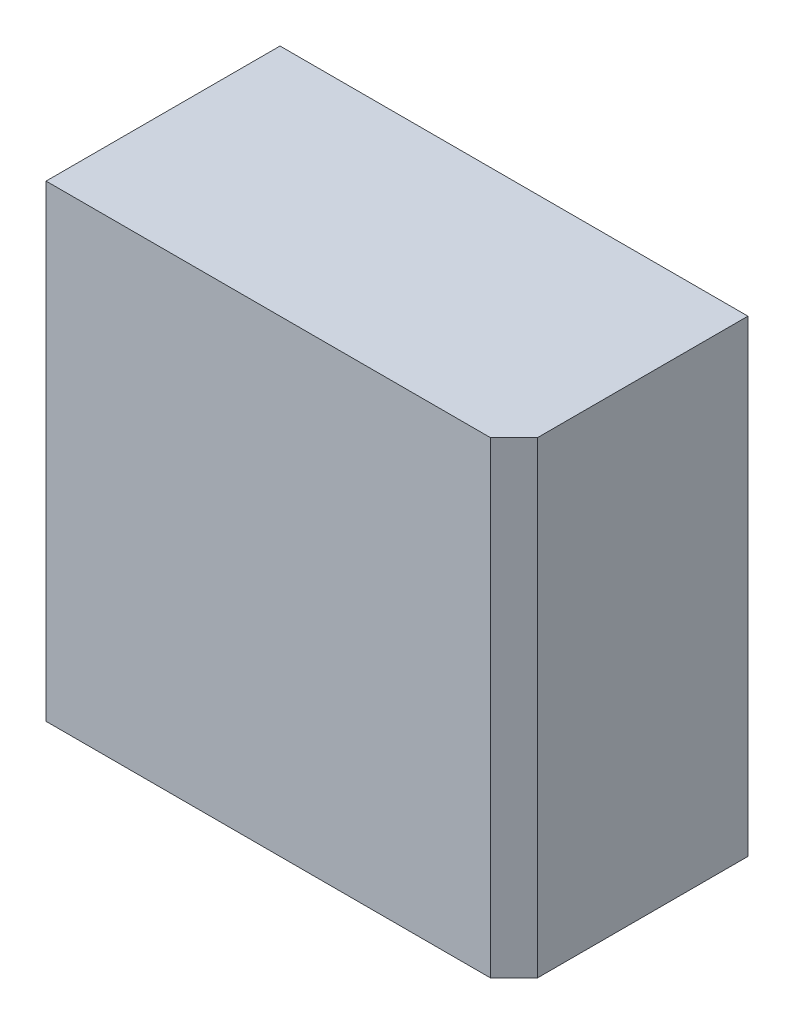
ISO-10303-21;
HEADER;
FILE_DESCRIPTION(('STEP AP214'),'2;1');
FILE_NAME('part.step','',(''),(''),'','','');
FILE_SCHEMA(('AUTOMOTIVE_DESIGN { 1 0 10303 214 1 1 1 1 }'));
ENDSEC;
DATA;
#1=APPLICATION_CONTEXT('core data for automotive mechanical design processes');
#2=APPLICATION_PROTOCOL_DEFINITION('international standard','automotive_design',2000,#1);
#3=PRODUCT_CONTEXT('',#1,'mechanical');
#4=PRODUCT('Part','Part','',(#3));
#5=PRODUCT_RELATED_PRODUCT_CATEGORY('part','',(#4));
#6=PRODUCT_DEFINITION_FORMATION('','',#4);
#7=PRODUCT_DEFINITION_CONTEXT('part definition',#1,'design');
#8=PRODUCT_DEFINITION('design','',#6,#7);
#9=PRODUCT_DEFINITION_SHAPE('','',#8);
#10=(LENGTH_UNIT() NAMED_UNIT(*) SI_UNIT(.MILLI.,.METRE.));
#11=(NAMED_UNIT(*) PLANE_ANGLE_UNIT() SI_UNIT($,.RADIAN.));
#12=(NAMED_UNIT(*) SI_UNIT($,.STERADIAN.) SOLID_ANGLE_UNIT());
#13=UNCERTAINTY_MEASURE_WITH_UNIT(LENGTH_MEASURE(1.E-05),#10,'distance_accuracy_value','');
#14=(GEOMETRIC_REPRESENTATION_CONTEXT(3) GLOBAL_UNCERTAINTY_ASSIGNED_CONTEXT((#13)) GLOBAL_UNIT_ASSIGNED_CONTEXT((#10,
#11,#12)) REPRESENTATION_CONTEXT('',''));
#15=CARTESIAN_POINT('',(0.,0.,0.));
#16=DIRECTION('',(0.,0.,1.));
#17=DIRECTION('',(1.,0.,0.));
#18=AXIS2_PLACEMENT_3D('',#15,#16,#17);
#19=CARTESIAN_POINT('',(-50.,-50.,50.));
#20=DIRECTION('',(1.,0.,0.));
#21=DIRECTION('',(0.,0.,-1.));
#22=AXIS2_PLACEMENT_3D('',#19,#20,#21);
#23=PLANE('',#22);
#24=DIRECTION('',(0.,-1.,0.));
#25=VECTOR('',#24,1.);
#26=CARTESIAN_POINT('',(-50.,-50.,0.));
#27=LINE('',#26,#25);
#28=CARTESIAN_POINT('',(-50.,50.,0.));
#29=VERTEX_POINT('',#28);
#30=CARTESIAN_POINT('',(-50.,-50.,0.));
#31=VERTEX_POINT('',#30);
#32=EDGE_CURVE('E112',#29,#31,#27,.T.);
#33=ORIENTED_EDGE('',*,*,#32,.T.);
#34=DIRECTION('',(0.,0.,-1.));
#35=VECTOR('',#34,1.);
#36=CARTESIAN_POINT('',(-50.,-50.,50.));
#37=LINE('',#36,#35);
#38=CARTESIAN_POINT('',(-50.,-50.,50.));
#39=VERTEX_POINT('',#38);
#40=EDGE_CURVE('E93',#39,#31,#37,.T.);
#41=ORIENTED_EDGE('',*,*,#40,.F.);
#42=DIRECTION('',(0.,-1.,0.));
#43=VECTOR('',#42,1.);
#44=CARTESIAN_POINT('',(-50.,-50.,50.));
#45=LINE('',#44,#43);
#46=CARTESIAN_POINT('',(-50.,50.,50.));
#47=VERTEX_POINT('',#46);
#48=EDGE_CURVE('E101',#47,#39,#45,.T.);
#49=ORIENTED_EDGE('',*,*,#48,.F.);
#50=DIRECTION('',(0.,0.,-1.));
#51=VECTOR('',#50,1.);
#52=CARTESIAN_POINT('',(-50.,50.,50.));
#53=LINE('',#52,#51);
#54=EDGE_CURVE('E128',#47,#29,#53,.T.);
#55=ORIENTED_EDGE('',*,*,#54,.T.);
#56=EDGE_LOOP('',(#33,#41,#49,#55));
#57=FACE_BOUND('',#56,.T.);
#58=ADVANCED_FACE('F41',(#57),#23,.F.);
#59=CARTESIAN_POINT('',(50.,-50.,50.));
#60=DIRECTION('',(0.,1.,0.));
#61=DIRECTION('',(-1.,0.,0.));
#62=AXIS2_PLACEMENT_3D('',#59,#60,#61);
#63=PLANE('',#62);
#64=DIRECTION('',(0.,0.,-1.));
#65=VECTOR('',#64,1.);
#66=CARTESIAN_POINT('',(50.,-50.,50.));
#67=LINE('',#66,#65);
#68=CARTESIAN_POINT('',(50.,-50.,45.));
#69=VERTEX_POINT('',#68);
#70=CARTESIAN_POINT('',(50.,-50.,0.));
#71=VERTEX_POINT('',#70);
#72=EDGE_CURVE('E115',#69,#71,#67,.T.);
#73=ORIENTED_EDGE('',*,*,#72,.F.);
#74=DIRECTION('',(-0.707106781186545,0.,0.70710678118655));
#75=VECTOR('',#74,1.);
#76=CARTESIAN_POINT('',(45.,-50.,50.));
#77=LINE('',#76,#75);
#78=CARTESIAN_POINT('',(45.,-50.,50.));
#79=VERTEX_POINT('',#78);
#80=EDGE_CURVE('E11',#69,#79,#77,.T.);
#81=ORIENTED_EDGE('',*,*,#80,.T.);
#82=DIRECTION('',(1.,0.,0.));
#83=VECTOR('',#82,1.);
#84=CARTESIAN_POINT('',(50.,-50.,50.));
#85=LINE('',#84,#83);
#86=EDGE_CURVE('E88',#39,#79,#85,.T.);
#87=ORIENTED_EDGE('',*,*,#86,.F.);
#88=ORIENTED_EDGE('',*,*,#40,.T.);
#89=DIRECTION('',(1.,0.,0.));
#90=VECTOR('',#89,1.);
#91=CARTESIAN_POINT('',(50.,-50.,0.));
#92=LINE('',#91,#90);
#93=EDGE_CURVE('E137',#31,#71,#92,.T.);
#94=ORIENTED_EDGE('',*,*,#93,.T.);
#95=EDGE_LOOP('',(#73,#81,#87,#88,#94));
#96=FACE_BOUND('',#95,.T.);
#97=ADVANCED_FACE('F90',(#96),#63,.F.);
#98=CARTESIAN_POINT('',(50.,-50.,50.));
#99=DIRECTION('',(-1.,0.,0.));
#100=DIRECTION('',(0.,0.,1.));
#101=AXIS2_PLACEMENT_3D('',#98,#99,#100);
#102=PLANE('',#101);
#103=DIRECTION('',(0.,0.,-1.));
#104=VECTOR('',#103,1.);
#105=CARTESIAN_POINT('',(50.,50.,50.));
#106=LINE('',#105,#104);
#107=CARTESIAN_POINT('',(50.,50.,45.));
#108=VERTEX_POINT('',#107);
#109=CARTESIAN_POINT('',(50.,50.,0.));
#110=VERTEX_POINT('',#109);
#111=EDGE_CURVE('E120',#108,#110,#106,.T.);
#112=ORIENTED_EDGE('',*,*,#111,.F.);
#113=DIRECTION('',(0.,-1.,0.));
#114=VECTOR('',#113,1.);
#115=CARTESIAN_POINT('',(50.,-50.,45.));
#116=LINE('',#115,#114);
#117=EDGE_CURVE('E51',#108,#69,#116,.T.);
#118=ORIENTED_EDGE('',*,*,#117,.T.);
#119=ORIENTED_EDGE('',*,*,#72,.T.);
#120=DIRECTION('',(0.,1.,0.));
#121=VECTOR('',#120,1.);
#122=CARTESIAN_POINT('',(50.,-50.,0.));
#123=LINE('',#122,#121);
#124=EDGE_CURVE('E133',#71,#110,#123,.T.);
#125=ORIENTED_EDGE('',*,*,#124,.T.);
#126=EDGE_LOOP('',(#112,#118,#119,#125));
#127=FACE_BOUND('',#126,.T.);
#128=ADVANCED_FACE('F147',(#127),#102,.F.);
#129=CARTESIAN_POINT('',(50.,50.,50.));
#130=DIRECTION('',(0.,-1.,0.));
#131=DIRECTION('',(1.,0.,0.));
#132=AXIS2_PLACEMENT_3D('',#129,#130,#131);
#133=PLANE('',#132);
#134=DIRECTION('',(-1.,0.,0.));
#135=VECTOR('',#134,1.);
#136=CARTESIAN_POINT('',(50.,50.,50.));
#137=LINE('',#136,#135);
#138=CARTESIAN_POINT('',(45.,50.,50.));
#139=VERTEX_POINT('',#138);
#140=EDGE_CURVE('E100',#139,#47,#137,.T.);
#141=ORIENTED_EDGE('',*,*,#140,.F.);
#142=DIRECTION('',(0.707106781186545,0.,-0.70710678118655));
#143=VECTOR('',#142,1.);
#144=CARTESIAN_POINT('',(45.,50.,50.));
#145=LINE('',#144,#143);
#146=EDGE_CURVE('E65',#139,#108,#145,.T.);
#147=ORIENTED_EDGE('',*,*,#146,.T.);
#148=ORIENTED_EDGE('',*,*,#111,.T.);
#149=DIRECTION('',(-1.,0.,0.));
#150=VECTOR('',#149,1.);
#151=CARTESIAN_POINT('',(50.,50.,0.));
#152=LINE('',#151,#150);
#153=EDGE_CURVE('E109',#110,#29,#152,.T.);
#154=ORIENTED_EDGE('',*,*,#153,.T.);
#155=ORIENTED_EDGE('',*,*,#54,.F.);
#156=EDGE_LOOP('',(#141,#147,#148,#154,#155));
#157=FACE_BOUND('',#156,.T.);
#158=ADVANCED_FACE('F149',(#157),#133,.F.);
#159=CARTESIAN_POINT('',(0.,0.,50.));
#160=DIRECTION('',(0.,0.,1.));
#161=DIRECTION('',(1.,0.,0.));
#162=AXIS2_PLACEMENT_3D('',#159,#160,#161);
#163=PLANE('',#162);
#164=ORIENTED_EDGE('',*,*,#86,.T.);
#165=DIRECTION('',(0.,1.,0.));
#166=VECTOR('',#165,1.);
#167=CARTESIAN_POINT('',(45.,50.,50.));
#168=LINE('',#167,#166);
#169=EDGE_CURVE('E114',#79,#139,#168,.T.);
#170=ORIENTED_EDGE('',*,*,#169,.T.);
#171=ORIENTED_EDGE('',*,*,#140,.T.);
#172=ORIENTED_EDGE('',*,*,#48,.T.);
#173=EDGE_LOOP('',(#164,#170,#171,#172));
#174=FACE_BOUND('',#173,.T.);
#175=ADVANCED_FACE('F104',(#174),#163,.T.);
#176=CARTESIAN_POINT('',(0.,0.,0.));
#177=DIRECTION('',(0.,0.,1.));
#178=DIRECTION('',(1.,0.,0.));
#179=AXIS2_PLACEMENT_3D('',#176,#177,#178);
#180=PLANE('',#179);
#181=ORIENTED_EDGE('',*,*,#32,.F.);
#182=ORIENTED_EDGE('',*,*,#153,.F.);
#183=ORIENTED_EDGE('',*,*,#124,.F.);
#184=ORIENTED_EDGE('',*,*,#93,.F.);
#185=EDGE_LOOP('',(#181,#182,#183,#184));
#186=FACE_BOUND('',#185,.T.);
#187=ADVANCED_FACE('F146',(#186),#180,.F.);
#188=CARTESIAN_POINT('',(45.,0.,50.));
#189=DIRECTION('',(0.70710678118655,0.,0.707106781186545));
#190=DIRECTION('',(0.,-1.,0.));
#191=AXIS2_PLACEMENT_3D('',#188,#189,#190);
#192=PLANE('',#191);
#193=ORIENTED_EDGE('',*,*,#80,.F.);
#194=ORIENTED_EDGE('',*,*,#117,.F.);
#195=ORIENTED_EDGE('',*,*,#146,.F.);
#196=ORIENTED_EDGE('',*,*,#169,.F.);
#197=EDGE_LOOP('',(#193,#194,#195,#196));
#198=FACE_BOUND('',#197,.T.);
#199=ADVANCED_FACE('F44',(#198),#192,.T.);
#200=CLOSED_SHELL('',(#58,#97,#128,#158,#175,#187,#199));
#201=MANIFOLD_SOLID_BREP('B2',#200);
#202=ADVANCED_BREP_SHAPE_REPRESENTATION('',(#18,#201),#14);
#203=SHAPE_DEFINITION_REPRESENTATION(#9,#202);
ENDSEC;
END-ISO-10303-21;
